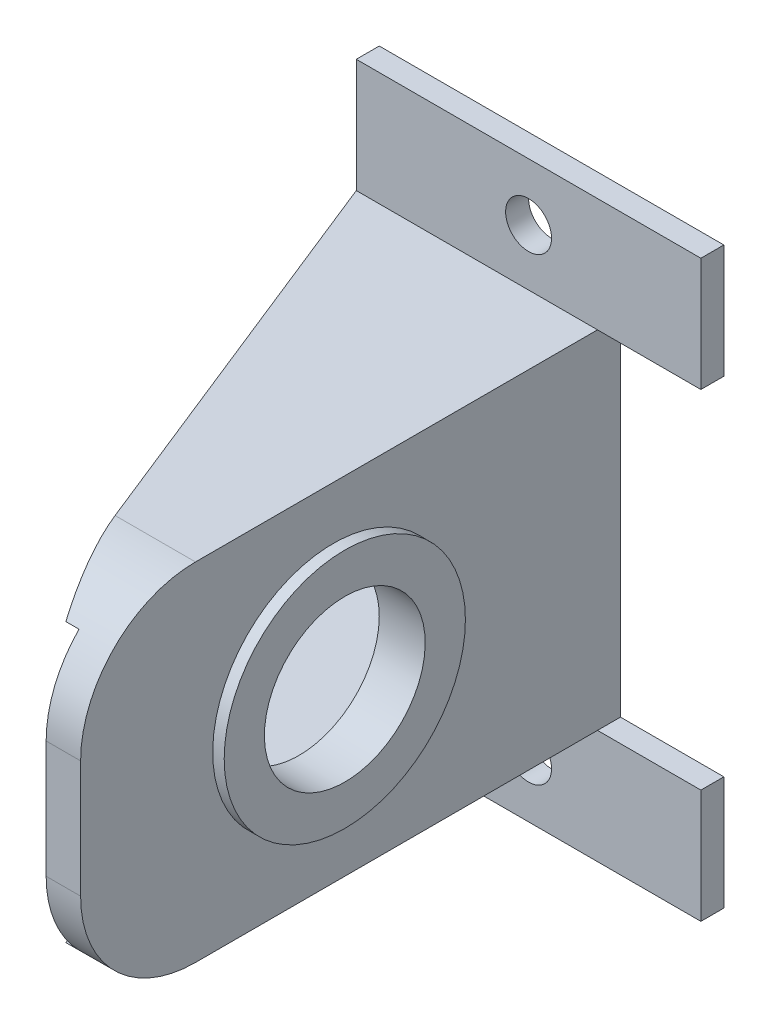
ISO-10303-21;
HEADER;
FILE_DESCRIPTION(('STEP AP214'),'2;1');
FILE_NAME('part.step','',(''),(''),'','','');
FILE_SCHEMA(('AUTOMOTIVE_DESIGN { 1 0 10303 214 1 1 1 1 }'));
ENDSEC;
DATA;
#1=APPLICATION_CONTEXT('core data for automotive mechanical design processes');
#2=APPLICATION_PROTOCOL_DEFINITION('international standard','automotive_design',2000,#1);
#3=PRODUCT_CONTEXT('',#1,'mechanical');
#4=PRODUCT('Part','Part','',(#3));
#5=PRODUCT_RELATED_PRODUCT_CATEGORY('part','',(#4));
#6=PRODUCT_DEFINITION_FORMATION('','',#4);
#7=PRODUCT_DEFINITION_CONTEXT('part definition',#1,'design');
#8=PRODUCT_DEFINITION('design','',#6,#7);
#9=PRODUCT_DEFINITION_SHAPE('','',#8);
#10=(LENGTH_UNIT() NAMED_UNIT(*) SI_UNIT(.MILLI.,.METRE.));
#11=(NAMED_UNIT(*) PLANE_ANGLE_UNIT() SI_UNIT($,.RADIAN.));
#12=(NAMED_UNIT(*) SI_UNIT($,.STERADIAN.) SOLID_ANGLE_UNIT());
#13=UNCERTAINTY_MEASURE_WITH_UNIT(LENGTH_MEASURE(1.E-05),#10,'distance_accuracy_value','');
#14=(GEOMETRIC_REPRESENTATION_CONTEXT(3) GLOBAL_UNCERTAINTY_ASSIGNED_CONTEXT((#13)) GLOBAL_UNIT_ASSIGNED_CONTEXT((#10,
#11,#12)) REPRESENTATION_CONTEXT('',''));
#15=CARTESIAN_POINT('',(0.,0.,0.));
#16=DIRECTION('',(0.,0.,1.));
#17=DIRECTION('',(1.,0.,0.));
#18=AXIS2_PLACEMENT_3D('',#15,#16,#17);
#19=CARTESIAN_POINT('',(0.,0.,2.));
#20=DIRECTION('',(0.,0.,-1.));
#21=DIRECTION('',(-1.,0.,0.));
#22=AXIS2_PLACEMENT_3D('',#19,#20,#21);
#23=PLANE('',#22);
#24=CARTESIAN_POINT('',(15.,5.,2.));
#25=DIRECTION('',(0.,0.,1.));
#26=DIRECTION('',(1.,0.,0.));
#27=AXIS2_PLACEMENT_3D('',#24,#25,#26);
#28=CIRCLE('',#27,2.);
#29=CARTESIAN_POINT('',(17.,5.,2.));
#30=VERTEX_POINT('',#29);
#31=EDGE_CURVE('E305',#30,#30,#28,.T.);
#32=ORIENTED_EDGE('',*,*,#31,.F.);
#33=EDGE_LOOP('',(#32));
#34=FACE_BOUND('',#33,.T.);
#35=DIRECTION('',(1.,0.,0.));
#36=VECTOR('',#35,1.);
#37=CARTESIAN_POINT('',(21.,9.90000000000001,2.));
#38=LINE('',#37,#36);
#39=CARTESIAN_POINT('',(0.,9.90000000000001,2.));
#40=VERTEX_POINT('',#39);
#41=CARTESIAN_POINT('',(21.,9.90000000000001,2.));
#42=VERTEX_POINT('',#41);
#43=EDGE_CURVE('E162',#40,#42,#38,.T.);
#44=ORIENTED_EDGE('',*,*,#43,.F.);
#45=DIRECTION('',(0.,-1.,0.));
#46=VECTOR('',#45,1.);
#47=CARTESIAN_POINT('',(0.,0.,2.));
#48=LINE('',#47,#46);
#49=CARTESIAN_POINT('',(0.,0.,2.));
#50=VERTEX_POINT('',#49);
#51=EDGE_CURVE('E167',#40,#50,#48,.T.);
#52=ORIENTED_EDGE('',*,*,#51,.T.);
#53=DIRECTION('',(1.,0.,0.));
#54=VECTOR('',#53,1.);
#55=CARTESIAN_POINT('',(0.,0.,2.));
#56=LINE('',#55,#54);
#57=CARTESIAN_POINT('',(30.,0.,2.));
#58=VERTEX_POINT('',#57);
#59=EDGE_CURVE('E189',#50,#58,#56,.T.);
#60=ORIENTED_EDGE('',*,*,#59,.T.);
#61=DIRECTION('',(0.,1.,0.));
#62=VECTOR('',#61,1.);
#63=CARTESIAN_POINT('',(30.,9.90000000000001,2.));
#64=LINE('',#63,#62);
#65=CARTESIAN_POINT('',(30.,9.90000000000001,2.));
#66=VERTEX_POINT('',#65);
#67=EDGE_CURVE('E194',#58,#66,#64,.T.);
#68=ORIENTED_EDGE('',*,*,#67,.T.);
#69=DIRECTION('',(-1.,0.,0.));
#70=VECTOR('',#69,1.);
#71=CARTESIAN_POINT('',(21.,9.90000000000001,2.));
#72=LINE('',#71,#70);
#73=EDGE_CURVE('E170',#66,#42,#72,.T.);
#74=ORIENTED_EDGE('',*,*,#73,.T.);
#75=EDGE_LOOP('',(#44,#52,#60,#68,#74));
#76=FACE_BOUND('',#75,.T.);
#77=ADVANCED_FACE('F32',(#34,#76),#23,.F.);
#78=DIRECTION('',(-1.,0.,0.));
#79=VECTOR('',#78,1.);
#80=CARTESIAN_POINT('',(18.,12.9,2.));
#81=LINE('',#80,#79);
#82=CARTESIAN_POINT('',(18.,12.9,2.));
#83=VERTEX_POINT('',#82);
#84=CARTESIAN_POINT('',(0.,12.9,2.));
#85=VERTEX_POINT('',#84);
#86=EDGE_CURVE('E173',#83,#85,#81,.T.);
#87=ORIENTED_EDGE('',*,*,#86,.F.);
#88=DIRECTION('',(0.,-1.,0.));
#89=VECTOR('',#88,1.);
#90=CARTESIAN_POINT('',(18.,37.1,2.));
#91=LINE('',#90,#89);
#92=CARTESIAN_POINT('',(18.,37.1,2.));
#93=VERTEX_POINT('',#92);
#94=EDGE_CURVE('E381',#93,#83,#91,.T.);
#95=ORIENTED_EDGE('',*,*,#94,.F.);
#96=DIRECTION('',(1.,0.,0.));
#97=VECTOR('',#96,1.);
#98=CARTESIAN_POINT('',(0.,37.1,2.));
#99=LINE('',#98,#97);
#100=CARTESIAN_POINT('',(0.,37.1,2.));
#101=VERTEX_POINT('',#100);
#102=EDGE_CURVE('E296',#101,#93,#99,.T.);
#103=ORIENTED_EDGE('',*,*,#102,.F.);
#104=EDGE_CURVE('E180',#101,#85,#48,.T.);
#105=ORIENTED_EDGE('',*,*,#104,.T.);
#106=EDGE_LOOP('',(#87,#95,#103,#105));
#107=FACE_BOUND('',#106,.T.);
#108=ADVANCED_FACE('F336',(#107),#23,.F.);
#109=CARTESIAN_POINT('',(15.,45.,2.));
#110=DIRECTION('',(0.,0.,1.));
#111=DIRECTION('',(1.,0.,0.));
#112=AXIS2_PLACEMENT_3D('',#109,#110,#111);
#113=CIRCLE('',#112,2.);
#114=CARTESIAN_POINT('',(17.,45.,2.));
#115=VERTEX_POINT('',#114);
#116=EDGE_CURVE('E209',#115,#115,#113,.T.);
#117=ORIENTED_EDGE('',*,*,#116,.F.);
#118=EDGE_LOOP('',(#117));
#119=FACE_BOUND('',#118,.T.);
#120=DIRECTION('',(-1.,0.,0.));
#121=VECTOR('',#120,1.);
#122=CARTESIAN_POINT('',(18.,40.1,2.));
#123=LINE('',#122,#121);
#124=CARTESIAN_POINT('',(21.,40.1,2.));
#125=VERTEX_POINT('',#124);
#126=CARTESIAN_POINT('',(0.,40.1,2.));
#127=VERTEX_POINT('',#126);
#128=EDGE_CURVE('E351',#125,#127,#123,.T.);
#129=ORIENTED_EDGE('',*,*,#128,.F.);
#130=DIRECTION('',(1.,0.,0.));
#131=VECTOR('',#130,1.);
#132=CARTESIAN_POINT('',(30.,40.1,2.));
#133=LINE('',#132,#131);
#134=CARTESIAN_POINT('',(30.,40.1,2.));
#135=VERTEX_POINT('',#134);
#136=EDGE_CURVE('E199',#125,#135,#133,.T.);
#137=ORIENTED_EDGE('',*,*,#136,.T.);
#138=DIRECTION('',(0.,1.,0.));
#139=VECTOR('',#138,1.);
#140=CARTESIAN_POINT('',(30.,50.,2.));
#141=LINE('',#140,#139);
#142=CARTESIAN_POINT('',(30.,50.,2.));
#143=VERTEX_POINT('',#142);
#144=EDGE_CURVE('E201',#135,#143,#141,.T.);
#145=ORIENTED_EDGE('',*,*,#144,.T.);
#146=DIRECTION('',(-1.,0.,0.));
#147=VECTOR('',#146,1.);
#148=CARTESIAN_POINT('',(0.,50.,2.));
#149=LINE('',#148,#147);
#150=CARTESIAN_POINT('',(0.,50.,2.));
#151=VERTEX_POINT('',#150);
#152=EDGE_CURVE('E203',#143,#151,#149,.T.);
#153=ORIENTED_EDGE('',*,*,#152,.T.);
#154=EDGE_CURVE('E183',#151,#127,#48,.T.);
#155=ORIENTED_EDGE('',*,*,#154,.T.);
#156=EDGE_LOOP('',(#129,#137,#145,#153,#155));
#157=FACE_BOUND('',#156,.T.);
#158=ADVANCED_FACE('F338',(#119,#157),#23,.F.);
#159=CARTESIAN_POINT('',(0.,0.,0.));
#160=DIRECTION('',(0.,0.,-1.));
#161=DIRECTION('',(-1.,0.,0.));
#162=AXIS2_PLACEMENT_3D('',#159,#160,#161);
#163=PLANE('',#162);
#164=CARTESIAN_POINT('',(15.,45.,0.));
#165=DIRECTION('',(0.,0.,1.));
#166=DIRECTION('',(1.,0.,0.));
#167=AXIS2_PLACEMENT_3D('',#164,#165,#166);
#168=CIRCLE('',#167,2.);
#169=CARTESIAN_POINT('',(17.,45.,0.));
#170=VERTEX_POINT('',#169);
#171=EDGE_CURVE('E308',#170,#170,#168,.T.);
#172=ORIENTED_EDGE('',*,*,#171,.T.);
#173=EDGE_LOOP('',(#172));
#174=FACE_BOUND('',#173,.T.);
#175=DIRECTION('',(0.,-1.,0.));
#176=VECTOR('',#175,1.);
#177=CARTESIAN_POINT('',(0.,0.,0.));
#178=LINE('',#177,#176);
#179=CARTESIAN_POINT('',(0.,50.,0.));
#180=VERTEX_POINT('',#179);
#181=CARTESIAN_POINT('',(0.,0.,0.));
#182=VERTEX_POINT('',#181);
#183=EDGE_CURVE('E206',#180,#182,#178,.T.);
#184=ORIENTED_EDGE('',*,*,#183,.F.);
#185=DIRECTION('',(-1.,0.,0.));
#186=VECTOR('',#185,1.);
#187=CARTESIAN_POINT('',(0.,50.,0.));
#188=LINE('',#187,#186);
#189=CARTESIAN_POINT('',(30.,50.,0.));
#190=VERTEX_POINT('',#189);
#191=EDGE_CURVE('E181',#190,#180,#188,.T.);
#192=ORIENTED_EDGE('',*,*,#191,.F.);
#193=DIRECTION('',(0.,1.,0.));
#194=VECTOR('',#193,1.);
#195=CARTESIAN_POINT('',(30.,50.,0.));
#196=LINE('',#195,#194);
#197=CARTESIAN_POINT('',(30.,40.1,0.));
#198=VERTEX_POINT('',#197);
#199=EDGE_CURVE('E184',#198,#190,#196,.T.);
#200=ORIENTED_EDGE('',*,*,#199,.F.);
#201=DIRECTION('',(1.,0.,0.));
#202=VECTOR('',#201,1.);
#203=CARTESIAN_POINT('',(30.,40.1,0.));
#204=LINE('',#203,#202);
#205=CARTESIAN_POINT('',(21.,40.1,0.));
#206=VERTEX_POINT('',#205);
#207=EDGE_CURVE('E217',#206,#198,#204,.T.);
#208=ORIENTED_EDGE('',*,*,#207,.F.);
#209=DIRECTION('',(0.,1.,0.));
#210=VECTOR('',#209,1.);
#211=CARTESIAN_POINT('',(21.,40.1,0.));
#212=LINE('',#211,#210);
#213=CARTESIAN_POINT('',(21.,9.90000000000001,0.));
#214=VERTEX_POINT('',#213);
#215=EDGE_CURVE('E215',#214,#206,#212,.T.);
#216=ORIENTED_EDGE('',*,*,#215,.F.);
#217=DIRECTION('',(-1.,0.,0.));
#218=VECTOR('',#217,1.);
#219=CARTESIAN_POINT('',(21.,9.90000000000001,0.));
#220=LINE('',#219,#218);
#221=CARTESIAN_POINT('',(30.,9.90000000000001,0.));
#222=VERTEX_POINT('',#221);
#223=EDGE_CURVE('E213',#222,#214,#220,.T.);
#224=ORIENTED_EDGE('',*,*,#223,.F.);
#225=DIRECTION('',(0.,1.,0.));
#226=VECTOR('',#225,1.);
#227=CARTESIAN_POINT('',(30.,9.90000000000001,0.));
#228=LINE('',#227,#226);
#229=CARTESIAN_POINT('',(30.,0.,0.));
#230=VERTEX_POINT('',#229);
#231=EDGE_CURVE('E211',#230,#222,#228,.T.);
#232=ORIENTED_EDGE('',*,*,#231,.F.);
#233=DIRECTION('',(1.,0.,0.));
#234=VECTOR('',#233,1.);
#235=CARTESIAN_POINT('',(0.,0.,0.));
#236=LINE('',#235,#234);
#237=EDGE_CURVE('E208',#182,#230,#236,.T.);
#238=ORIENTED_EDGE('',*,*,#237,.F.);
#239=EDGE_LOOP('',(#184,#192,#200,#208,#216,#224,#232,#238));
#240=FACE_BOUND('',#239,.T.);
#241=CARTESIAN_POINT('',(15.,5.,0.));
#242=DIRECTION('',(0.,0.,1.));
#243=DIRECTION('',(1.,0.,0.));
#244=AXIS2_PLACEMENT_3D('',#241,#242,#243);
#245=CIRCLE('',#244,2.);
#246=CARTESIAN_POINT('',(17.,5.,0.));
#247=VERTEX_POINT('',#246);
#248=EDGE_CURVE('E299',#247,#247,#245,.T.);
#249=ORIENTED_EDGE('',*,*,#248,.T.);
#250=EDGE_LOOP('',(#249));
#251=FACE_BOUND('',#250,.T.);
#252=ADVANCED_FACE('F315',(#174,#240,#251),#163,.T.);
#253=CARTESIAN_POINT('',(0.,0.,2.));
#254=DIRECTION('',(1.,0.,0.));
#255=DIRECTION('',(0.,0.,-1.));
#256=AXIS2_PLACEMENT_3D('',#253,#254,#255);
#257=PLANE('',#256);
#258=ORIENTED_EDGE('',*,*,#51,.F.);
#259=DIRECTION('',(0.,-1.,0.));
#260=VECTOR('',#259,1.);
#261=CARTESIAN_POINT('',(0.,88.5664832642105,2.));
#262=LINE('',#261,#260);
#263=EDGE_CURVE('E149',#85,#40,#262,.T.);
#264=ORIENTED_EDGE('',*,*,#263,.F.);
#265=ORIENTED_EDGE('',*,*,#104,.F.);
#266=EDGE_CURVE('E157',#127,#101,#262,.T.);
#267=ORIENTED_EDGE('',*,*,#266,.F.);
#268=ORIENTED_EDGE('',*,*,#154,.F.);
#269=DIRECTION('',(0.,0.,-1.));
#270=VECTOR('',#269,1.);
#271=CARTESIAN_POINT('',(0.,50.,2.));
#272=LINE('',#271,#270);
#273=EDGE_CURVE('E205',#151,#180,#272,.T.);
#274=ORIENTED_EDGE('',*,*,#273,.T.);
#275=ORIENTED_EDGE('',*,*,#183,.T.);
#276=DIRECTION('',(0.,0.,-1.));
#277=VECTOR('',#276,1.);
#278=CARTESIAN_POINT('',(0.,0.,2.));
#279=LINE('',#278,#277);
#280=EDGE_CURVE('E179',#50,#182,#279,.T.);
#281=ORIENTED_EDGE('',*,*,#280,.F.);
#282=EDGE_LOOP('',(#258,#264,#265,#267,#268,#274,#275,#281));
#283=FACE_BOUND('',#282,.T.);
#284=ADVANCED_FACE('F176',(#283),#257,.F.);
#285=CARTESIAN_POINT('',(0.,0.,2.));
#286=DIRECTION('',(0.,1.,0.));
#287=DIRECTION('',(0.,0.,1.));
#288=AXIS2_PLACEMENT_3D('',#285,#286,#287);
#289=PLANE('',#288);
#290=ORIENTED_EDGE('',*,*,#237,.T.);
#291=DIRECTION('',(0.,0.,-1.));
#292=VECTOR('',#291,1.);
#293=CARTESIAN_POINT('',(30.,0.,2.));
#294=LINE('',#293,#292);
#295=EDGE_CURVE('E237',#58,#230,#294,.T.);
#296=ORIENTED_EDGE('',*,*,#295,.F.);
#297=ORIENTED_EDGE('',*,*,#59,.F.);
#298=ORIENTED_EDGE('',*,*,#280,.T.);
#299=EDGE_LOOP('',(#290,#296,#297,#298));
#300=FACE_BOUND('',#299,.T.);
#301=ADVANCED_FACE('F475',(#300),#289,.F.);
#302=CARTESIAN_POINT('',(30.,9.90000000000001,2.));
#303=DIRECTION('',(-1.,0.,0.));
#304=DIRECTION('',(0.,0.,1.));
#305=AXIS2_PLACEMENT_3D('',#302,#303,#304);
#306=PLANE('',#305);
#307=ORIENTED_EDGE('',*,*,#231,.T.);
#308=DIRECTION('',(0.,0.,-1.));
#309=VECTOR('',#308,1.);
#310=CARTESIAN_POINT('',(30.,9.90000000000001,2.));
#311=LINE('',#310,#309);
#312=EDGE_CURVE('E234',#66,#222,#311,.T.);
#313=ORIENTED_EDGE('',*,*,#312,.F.);
#314=ORIENTED_EDGE('',*,*,#67,.F.);
#315=ORIENTED_EDGE('',*,*,#295,.T.);
#316=EDGE_LOOP('',(#307,#313,#314,#315));
#317=FACE_BOUND('',#316,.T.);
#318=ADVANCED_FACE('F516',(#317),#306,.F.);
#319=CARTESIAN_POINT('',(21.,9.90000000000001,2.));
#320=DIRECTION('',(0.,-1.,0.));
#321=DIRECTION('',(0.,0.,-1.));
#322=AXIS2_PLACEMENT_3D('',#319,#320,#321);
#323=PLANE('',#322);
#324=ORIENTED_EDGE('',*,*,#223,.T.);
#325=DIRECTION('',(0.,0.,-1.));
#326=VECTOR('',#325,1.);
#327=CARTESIAN_POINT('',(21.,9.90000000000001,2.));
#328=LINE('',#327,#326);
#329=EDGE_CURVE('E231',#42,#214,#328,.T.);
#330=ORIENTED_EDGE('',*,*,#329,.F.);
#331=ORIENTED_EDGE('',*,*,#73,.F.);
#332=ORIENTED_EDGE('',*,*,#312,.T.);
#333=EDGE_LOOP('',(#324,#330,#331,#332));
#334=FACE_BOUND('',#333,.T.);
#335=ADVANCED_FACE('F511',(#334),#323,.F.);
#336=CARTESIAN_POINT('',(21.,40.1,2.));
#337=DIRECTION('',(-1.,0.,0.));
#338=DIRECTION('',(0.,-1.,0.));
#339=AXIS2_PLACEMENT_3D('',#336,#337,#338);
#340=PLANE('',#339);
#341=CARTESIAN_POINT('',(21.,25.,25.));
#342=DIRECTION('',(-1.,0.,0.));
#343=DIRECTION('',(0.,-1.,0.));
#344=AXIS2_PLACEMENT_3D('',#341,#342,#343);
#345=CIRCLE('',#344,10.5);
#346=CARTESIAN_POINT('',(21.,14.5,25.));
#347=VERTEX_POINT('',#346);
#348=EDGE_CURVE('E241',#347,#347,#345,.F.);
#349=ORIENTED_EDGE('',*,*,#348,.F.);
#350=EDGE_LOOP('',(#349));
#351=FACE_BOUND('',#350,.T.);
#352=DIRECTION('',(0.,0.,-1.));
#353=VECTOR('',#352,1.);
#354=CARTESIAN_POINT('',(21.,40.1,47.));
#355=LINE('',#354,#353);
#356=CARTESIAN_POINT('',(21.,40.1,37.));
#357=VERTEX_POINT('',#356);
#358=EDGE_CURVE('E271',#357,#125,#355,.T.);
#359=ORIENTED_EDGE('',*,*,#358,.F.);
#360=CARTESIAN_POINT('',(21.,30.1,37.));
#361=DIRECTION('',(-1.,0.,0.));
#362=DIRECTION('',(0.,-1.,0.));
#363=AXIS2_PLACEMENT_3D('',#360,#361,#362);
#364=CIRCLE('',#363,10.);
#365=CARTESIAN_POINT('',(21.,30.1,47.));
#366=VERTEX_POINT('',#365);
#367=EDGE_CURVE('E262',#357,#366,#364,.F.);
#368=ORIENTED_EDGE('',*,*,#367,.T.);
#369=DIRECTION('',(0.,1.,0.));
#370=VECTOR('',#369,1.);
#371=CARTESIAN_POINT('',(21.,40.1,47.));
#372=LINE('',#371,#370);
#373=CARTESIAN_POINT('',(21.,19.9,47.));
#374=VERTEX_POINT('',#373);
#375=EDGE_CURVE('E172',#374,#366,#372,.T.);
#376=ORIENTED_EDGE('',*,*,#375,.F.);
#377=CARTESIAN_POINT('',(21.,19.9,37.));
#378=DIRECTION('',(-1.,0.,0.));
#379=DIRECTION('',(0.,-1.,0.));
#380=AXIS2_PLACEMENT_3D('',#377,#378,#379);
#381=CIRCLE('',#380,10.);
#382=CARTESIAN_POINT('',(21.,9.90000000000001,37.));
#383=VERTEX_POINT('',#382);
#384=EDGE_CURVE('E260',#374,#383,#381,.F.);
#385=ORIENTED_EDGE('',*,*,#384,.T.);
#386=DIRECTION('',(0.,0.,-1.));
#387=VECTOR('',#386,1.);
#388=CARTESIAN_POINT('',(21.,9.90000000000001,47.));
#389=LINE('',#388,#387);
#390=EDGE_CURVE('E301',#383,#42,#389,.T.);
#391=ORIENTED_EDGE('',*,*,#390,.T.);
#392=ORIENTED_EDGE('',*,*,#329,.T.);
#393=ORIENTED_EDGE('',*,*,#215,.T.);
#394=DIRECTION('',(0.,0.,-1.));
#395=VECTOR('',#394,1.);
#396=CARTESIAN_POINT('',(21.,40.1,2.));
#397=LINE('',#396,#395);
#398=EDGE_CURVE('E228',#125,#206,#397,.T.);
#399=ORIENTED_EDGE('',*,*,#398,.F.);
#400=EDGE_LOOP('',(#359,#368,#376,#385,#391,#392,#393,#399));
#401=FACE_BOUND('',#400,.T.);
#402=ADVANCED_FACE('F269',(#351,#401),#340,.F.);
#403=CARTESIAN_POINT('',(30.,40.1,2.));
#404=DIRECTION('',(0.,1.,0.));
#405=DIRECTION('',(0.,0.,1.));
#406=AXIS2_PLACEMENT_3D('',#403,#404,#405);
#407=PLANE('',#406);
#408=ORIENTED_EDGE('',*,*,#207,.T.);
#409=DIRECTION('',(0.,0.,-1.));
#410=VECTOR('',#409,1.);
#411=CARTESIAN_POINT('',(30.,40.1,2.));
#412=LINE('',#411,#410);
#413=EDGE_CURVE('E225',#135,#198,#412,.T.);
#414=ORIENTED_EDGE('',*,*,#413,.F.);
#415=ORIENTED_EDGE('',*,*,#136,.F.);
#416=ORIENTED_EDGE('',*,*,#398,.T.);
#417=EDGE_LOOP('',(#408,#414,#415,#416));
#418=FACE_BOUND('',#417,.T.);
#419=ADVANCED_FACE('F361',(#418),#407,.F.);
#420=CARTESIAN_POINT('',(30.,50.,2.));
#421=DIRECTION('',(-1.,0.,0.));
#422=DIRECTION('',(0.,0.,1.));
#423=AXIS2_PLACEMENT_3D('',#420,#421,#422);
#424=PLANE('',#423);
#425=ORIENTED_EDGE('',*,*,#199,.T.);
#426=DIRECTION('',(0.,0.,-1.));
#427=VECTOR('',#426,1.);
#428=CARTESIAN_POINT('',(30.,50.,2.));
#429=LINE('',#428,#427);
#430=EDGE_CURVE('E222',#143,#190,#429,.T.);
#431=ORIENTED_EDGE('',*,*,#430,.F.);
#432=ORIENTED_EDGE('',*,*,#144,.F.);
#433=ORIENTED_EDGE('',*,*,#413,.T.);
#434=EDGE_LOOP('',(#425,#431,#432,#433));
#435=FACE_BOUND('',#434,.T.);
#436=ADVANCED_FACE('F331',(#435),#424,.F.);
#437=CARTESIAN_POINT('',(0.,50.,2.));
#438=DIRECTION('',(0.,-1.,0.));
#439=DIRECTION('',(0.,0.,-1.));
#440=AXIS2_PLACEMENT_3D('',#437,#438,#439);
#441=PLANE('',#440);
#442=ORIENTED_EDGE('',*,*,#191,.T.);
#443=ORIENTED_EDGE('',*,*,#273,.F.);
#444=ORIENTED_EDGE('',*,*,#152,.F.);
#445=ORIENTED_EDGE('',*,*,#430,.T.);
#446=EDGE_LOOP('',(#442,#443,#444,#445));
#447=FACE_BOUND('',#446,.T.);
#448=ADVANCED_FACE('F321',(#447),#441,.F.);
#449=CARTESIAN_POINT('',(15.,45.,2.));
#450=DIRECTION('',(0.,0.,-1.));
#451=DIRECTION('',(-1.,0.,0.));
#452=AXIS2_PLACEMENT_3D('',#449,#450,#451);
#453=CYLINDRICAL_SURFACE('',#452,2.);
#454=ORIENTED_EDGE('',*,*,#116,.T.);
#455=EDGE_LOOP('',(#454));
#456=FACE_BOUND('',#455,.T.);
#457=ORIENTED_EDGE('',*,*,#171,.F.);
#458=EDGE_LOOP('',(#457));
#459=FACE_BOUND('',#458,.T.);
#460=ADVANCED_FACE('F318',(#456,#459),#453,.F.);
#461=CARTESIAN_POINT('',(15.,5.,2.));
#462=DIRECTION('',(0.,0.,-1.));
#463=DIRECTION('',(-1.,0.,0.));
#464=AXIS2_PLACEMENT_3D('',#461,#462,#463);
#465=CYLINDRICAL_SURFACE('',#464,2.);
#466=ORIENTED_EDGE('',*,*,#31,.T.);
#467=EDGE_LOOP('',(#466));
#468=FACE_BOUND('',#467,.T.);
#469=ORIENTED_EDGE('',*,*,#248,.F.);
#470=EDGE_LOOP('',(#469));
#471=FACE_BOUND('',#470,.T.);
#472=ADVANCED_FACE('F320',(#468,#471),#465,.F.);
#473=CARTESIAN_POINT('',(18.,40.1,47.));
#474=DIRECTION('',(0.,-1.,0.));
#475=DIRECTION('',(0.,0.,-1.));
#476=AXIS2_PLACEMENT_3D('',#473,#474,#475);
#477=PLANE('',#476);
#478=DIRECTION('',(-0.371390676354104,0.,-0.928476690885259));
#479=VECTOR('',#478,1.);
#480=CARTESIAN_POINT('',(0.,40.1,2.));
#481=LINE('',#480,#479);
#482=CARTESIAN_POINT('',(14.,40.1,37.));
#483=VERTEX_POINT('',#482);
#484=EDGE_CURVE('E373',#483,#127,#481,.T.);
#485=ORIENTED_EDGE('',*,*,#484,.F.);
#486=DIRECTION('',(-1.,0.,0.));
#487=VECTOR('',#486,1.);
#488=CARTESIAN_POINT('',(18.,40.1,37.));
#489=LINE('',#488,#487);
#490=EDGE_CURVE('E258',#483,#357,#489,.F.);
#491=ORIENTED_EDGE('',*,*,#490,.T.);
#492=ORIENTED_EDGE('',*,*,#358,.T.);
#493=ORIENTED_EDGE('',*,*,#128,.T.);
#494=EDGE_LOOP('',(#485,#491,#492,#493));
#495=FACE_BOUND('',#494,.T.);
#496=ADVANCED_FACE('F328',(#495),#477,.F.);
#497=CARTESIAN_POINT('',(0.,37.1,47.));
#498=DIRECTION('',(0.,1.,0.));
#499=DIRECTION('',(0.,0.,1.));
#500=AXIS2_PLACEMENT_3D('',#497,#498,#499);
#501=PLANE('',#500);
#502=DIRECTION('',(0.,0.,-1.));
#503=VECTOR('',#502,1.);
#504=CARTESIAN_POINT('',(18.,37.1,47.));
#505=LINE('',#504,#503);
#506=CARTESIAN_POINT('',(18.,37.1,44.1414284285429));
#507=VERTEX_POINT('',#506);
#508=EDGE_CURVE('E289',#507,#93,#505,.T.);
#509=ORIENTED_EDGE('',*,*,#508,.F.);
#510=DIRECTION('',(-1.,0.,0.));
#511=VECTOR('',#510,1.);
#512=CARTESIAN_POINT('',(18.,37.1,44.1414284285429));
#513=LINE('',#512,#511);
#514=CARTESIAN_POINT('',(16.8565713714171,37.1,44.1414284285429));
#515=VERTEX_POINT('',#514);
#516=EDGE_CURVE('E254',#507,#515,#513,.T.);
#517=ORIENTED_EDGE('',*,*,#516,.T.);
#518=DIRECTION('',(-0.371390676354104,0.,-0.928476690885259));
#519=VECTOR('',#518,1.);
#520=CARTESIAN_POINT('',(15.5172413793103,37.1,40.7931034482759));
#521=LINE('',#520,#519);
#522=EDGE_CURVE('E356',#515,#101,#521,.T.);
#523=ORIENTED_EDGE('',*,*,#522,.T.);
#524=ORIENTED_EDGE('',*,*,#102,.T.);
#525=EDGE_LOOP('',(#509,#517,#523,#524));
#526=FACE_BOUND('',#525,.T.);
#527=ADVANCED_FACE('F293',(#526),#501,.F.);
#528=CARTESIAN_POINT('',(18.,37.1,47.));
#529=DIRECTION('',(1.,0.,0.));
#530=DIRECTION('',(0.,0.,-1.));
#531=AXIS2_PLACEMENT_3D('',#528,#529,#530);
#532=PLANE('',#531);
#533=CARTESIAN_POINT('',(18.,25.,25.));
#534=DIRECTION('',(1.,0.,0.));
#535=DIRECTION('',(0.,0.,-1.));
#536=AXIS2_PLACEMENT_3D('',#533,#534,#535);
#537=CIRCLE('',#536,7.);
#538=CARTESIAN_POINT('',(18.,25.,18.));
#539=VERTEX_POINT('',#538);
#540=EDGE_CURVE('E629',#539,#539,#537,.F.);
#541=ORIENTED_EDGE('',*,*,#540,.F.);
#542=EDGE_LOOP('',(#541));
#543=FACE_BOUND('',#542,.T.);
#544=DIRECTION('',(0.,-1.,0.));
#545=VECTOR('',#544,1.);
#546=CARTESIAN_POINT('',(18.,37.1,47.));
#547=LINE('',#546,#545);
#548=CARTESIAN_POINT('',(18.,30.1,47.));
#549=VERTEX_POINT('',#548);
#550=CARTESIAN_POINT('',(18.,19.9,47.));
#551=VERTEX_POINT('',#550);
#552=EDGE_CURVE('E280',#549,#551,#547,.T.);
#553=ORIENTED_EDGE('',*,*,#552,.F.);
#554=CARTESIAN_POINT('',(18.,30.1,37.));
#555=DIRECTION('',(1.,0.,0.));
#556=DIRECTION('',(0.,0.,-1.));
#557=AXIS2_PLACEMENT_3D('',#554,#555,#556);
#558=CIRCLE('',#557,10.);
#559=EDGE_CURVE('E252',#549,#507,#558,.F.);
#560=ORIENTED_EDGE('',*,*,#559,.T.);
#561=ORIENTED_EDGE('',*,*,#508,.T.);
#562=ORIENTED_EDGE('',*,*,#94,.T.);
#563=DIRECTION('',(0.,0.,-1.));
#564=VECTOR('',#563,1.);
#565=CARTESIAN_POINT('',(18.,12.9,47.));
#566=LINE('',#565,#564);
#567=CARTESIAN_POINT('',(18.,12.9,44.1414284285429));
#568=VERTEX_POINT('',#567);
#569=EDGE_CURVE('E297',#568,#83,#566,.T.);
#570=ORIENTED_EDGE('',*,*,#569,.F.);
#571=CARTESIAN_POINT('',(18.,19.9,37.));
#572=DIRECTION('',(1.,0.,0.));
#573=DIRECTION('',(0.,0.,-1.));
#574=AXIS2_PLACEMENT_3D('',#571,#572,#573);
#575=CIRCLE('',#574,10.);
#576=EDGE_CURVE('E250',#568,#551,#575,.F.);
#577=ORIENTED_EDGE('',*,*,#576,.T.);
#578=EDGE_LOOP('',(#553,#560,#561,#562,#570,#577));
#579=FACE_BOUND('',#578,.T.);
#580=ADVANCED_FACE('F287',(#543,#579),#532,.F.);
#581=CARTESIAN_POINT('',(18.,12.9,47.));
#582=DIRECTION('',(0.,-1.,0.));
#583=DIRECTION('',(1.,0.,0.));
#584=AXIS2_PLACEMENT_3D('',#581,#582,#583);
#585=PLANE('',#584);
#586=DIRECTION('',(0.371390676354104,0.,0.928476690885259));
#587=VECTOR('',#586,1.);
#588=CARTESIAN_POINT('',(18.,12.9,47.));
#589=LINE('',#588,#587);
#590=CARTESIAN_POINT('',(16.8565713714171,12.9,44.1414284285429));
#591=VERTEX_POINT('',#590);
#592=EDGE_CURVE('E152',#85,#591,#589,.T.);
#593=ORIENTED_EDGE('',*,*,#592,.T.);
#594=DIRECTION('',(1.,0.,0.));
#595=VECTOR('',#594,1.);
#596=CARTESIAN_POINT('',(16.8565713714171,12.9,44.1414284285429));
#597=LINE('',#596,#595);
#598=EDGE_CURVE('E11',#591,#568,#597,.T.);
#599=ORIENTED_EDGE('',*,*,#598,.T.);
#600=ORIENTED_EDGE('',*,*,#569,.T.);
#601=ORIENTED_EDGE('',*,*,#86,.T.);
#602=EDGE_LOOP('',(#593,#599,#600,#601));
#603=FACE_BOUND('',#602,.T.);
#604=ADVANCED_FACE('F389',(#603),#585,.F.);
#605=CARTESIAN_POINT('',(21.,9.90000000000001,47.));
#606=DIRECTION('',(0.,1.,0.));
#607=DIRECTION('',(0.,0.,1.));
#608=AXIS2_PLACEMENT_3D('',#605,#606,#607);
#609=PLANE('',#608);
#610=ORIENTED_EDGE('',*,*,#390,.F.);
#611=DIRECTION('',(1.,0.,0.));
#612=VECTOR('',#611,1.);
#613=CARTESIAN_POINT('',(21.,9.90000000000001,37.));
#614=LINE('',#613,#612);
#615=CARTESIAN_POINT('',(14.,9.90000000000001,37.));
#616=VERTEX_POINT('',#615);
#617=EDGE_CURVE('E54',#383,#616,#614,.F.);
#618=ORIENTED_EDGE('',*,*,#617,.T.);
#619=DIRECTION('',(0.371390676354104,0.,0.928476690885259));
#620=VECTOR('',#619,1.);
#621=CARTESIAN_POINT('',(0.,9.90000000000001,2.));
#622=LINE('',#621,#620);
#623=EDGE_CURVE('E151',#40,#616,#622,.T.);
#624=ORIENTED_EDGE('',*,*,#623,.F.);
#625=ORIENTED_EDGE('',*,*,#43,.T.);
#626=EDGE_LOOP('',(#610,#618,#624,#625));
#627=FACE_BOUND('',#626,.T.);
#628=ADVANCED_FACE('F161',(#627),#609,.F.);
#629=CARTESIAN_POINT('',(0.,0.,47.));
#630=DIRECTION('',(0.,0.,-1.));
#631=DIRECTION('',(-1.,0.,0.));
#632=AXIS2_PLACEMENT_3D('',#629,#630,#631);
#633=PLANE('',#632);
#634=ORIENTED_EDGE('',*,*,#375,.T.);
#635=DIRECTION('',(-1.,0.,0.));
#636=VECTOR('',#635,1.);
#637=CARTESIAN_POINT('',(0.,30.1,47.));
#638=LINE('',#637,#636);
#639=EDGE_CURVE('E247',#366,#549,#638,.T.);
#640=ORIENTED_EDGE('',*,*,#639,.T.);
#641=ORIENTED_EDGE('',*,*,#552,.T.);
#642=DIRECTION('',(1.,0.,0.));
#643=VECTOR('',#642,1.);
#644=CARTESIAN_POINT('',(0.,19.9,47.));
#645=LINE('',#644,#643);
#646=EDGE_CURVE('E244',#551,#374,#645,.T.);
#647=ORIENTED_EDGE('',*,*,#646,.T.);
#648=EDGE_LOOP('',(#634,#640,#641,#647));
#649=FACE_BOUND('',#648,.T.);
#650=ADVANCED_FACE('F276',(#649),#633,.F.);
#651=CARTESIAN_POINT('',(0.,88.5664832642105,2.));
#652=DIRECTION('',(0.928476690885259,0.,-0.371390676354104));
#653=DIRECTION('',(-0.371390676354104,0.,-0.92847669088526));
#654=AXIS2_PLACEMENT_3D('',#651,#652,#653);
#655=PLANE('',#654);
#656=ORIENTED_EDGE('',*,*,#623,.T.);
#657=CARTESIAN_POINT('',(14.,19.9,37.));
#658=DIRECTION('',(0.928476690885259,0.,-0.371390676354104));
#659=DIRECTION('',(0.371390676354104,0.,0.92847669088526));
#660=AXIS2_PLACEMENT_3D('',#657,#658,#659);
#661=ELLIPSE('',#660,10.770329614269,10.);
#662=EDGE_CURVE('E40',#616,#591,#661,.F.);
#663=ORIENTED_EDGE('',*,*,#662,.T.);
#664=ORIENTED_EDGE('',*,*,#592,.F.);
#665=ORIENTED_EDGE('',*,*,#263,.T.);
#666=EDGE_LOOP('',(#656,#663,#664,#665));
#667=FACE_BOUND('',#666,.T.);
#668=ADVANCED_FACE('F150',(#667),#655,.F.);
#669=ORIENTED_EDGE('',*,*,#522,.F.);
#670=CARTESIAN_POINT('',(14.,30.1,37.));
#671=DIRECTION('',(0.928476690885259,0.,-0.371390676354104));
#672=DIRECTION('',(-0.371390676354104,0.,-0.92847669088526));
#673=AXIS2_PLACEMENT_3D('',#670,#671,#672);
#674=ELLIPSE('',#673,10.770329614269,10.);
#675=EDGE_CURVE('E256',#515,#483,#674,.F.);
#676=ORIENTED_EDGE('',*,*,#675,.T.);
#677=ORIENTED_EDGE('',*,*,#484,.T.);
#678=ORIENTED_EDGE('',*,*,#266,.T.);
#679=EDGE_LOOP('',(#669,#676,#677,#678));
#680=FACE_BOUND('',#679,.T.);
#681=ADVANCED_FACE('F407',(#680),#655,.F.);
#682=CARTESIAN_POINT('',(22.,25.,25.));
#683=DIRECTION('',(-1.,0.,0.));
#684=DIRECTION('',(0.,-1.,0.));
#685=AXIS2_PLACEMENT_3D('',#682,#683,#684);
#686=CYLINDRICAL_SURFACE('',#685,10.5);
#687=CARTESIAN_POINT('',(22.,25.,25.));
#688=DIRECTION('',(1.,0.,0.));
#689=DIRECTION('',(0.,1.,0.));
#690=AXIS2_PLACEMENT_3D('',#687,#688,#689);
#691=CIRCLE('',#690,10.5);
#692=CARTESIAN_POINT('',(22.,35.5,25.));
#693=VERTEX_POINT('',#692);
#694=EDGE_CURVE('E163',#693,#693,#691,.T.);
#695=ORIENTED_EDGE('',*,*,#694,.F.);
#696=EDGE_LOOP('',(#695));
#697=FACE_BOUND('',#696,.T.);
#698=ORIENTED_EDGE('',*,*,#348,.T.);
#699=EDGE_LOOP('',(#698));
#700=FACE_BOUND('',#699,.T.);
#701=ADVANCED_FACE('F409',(#697,#700),#686,.T.);
#702=CARTESIAN_POINT('',(22.,25.,25.));
#703=DIRECTION('',(1.,0.,0.));
#704=DIRECTION('',(0.,1.,0.));
#705=AXIS2_PLACEMENT_3D('',#702,#703,#704);
#706=PLANE('',#705);
#707=CARTESIAN_POINT('',(22.,25.,25.));
#708=DIRECTION('',(1.,0.,0.));
#709=DIRECTION('',(0.,1.,0.));
#710=AXIS2_PLACEMENT_3D('',#707,#708,#709);
#711=CIRCLE('',#710,7.);
#712=CARTESIAN_POINT('',(22.,32.,25.));
#713=VERTEX_POINT('',#712);
#714=EDGE_CURVE('E626',#713,#713,#711,.T.);
#715=ORIENTED_EDGE('',*,*,#714,.F.);
#716=EDGE_LOOP('',(#715));
#717=FACE_BOUND('',#716,.T.);
#718=ORIENTED_EDGE('',*,*,#694,.T.);
#719=EDGE_LOOP('',(#718));
#720=FACE_BOUND('',#719,.T.);
#721=ADVANCED_FACE('F415',(#717,#720),#706,.T.);
#722=CARTESIAN_POINT('',(-0.00100000000000447,25.,25.));
#723=DIRECTION('',(1.,0.,0.));
#724=DIRECTION('',(0.,1.,0.));
#725=AXIS2_PLACEMENT_3D('',#722,#723,#724);
#726=CYLINDRICAL_SURFACE('',#725,7.);
#727=ORIENTED_EDGE('',*,*,#714,.T.);
#728=EDGE_LOOP('',(#727));
#729=FACE_BOUND('',#728,.T.);
#730=ORIENTED_EDGE('',*,*,#540,.T.);
#731=EDGE_LOOP('',(#730));
#732=FACE_BOUND('',#731,.T.);
#733=ADVANCED_FACE('F442',(#729,#732),#726,.F.);
#734=CARTESIAN_POINT('',(0.,30.1,37.));
#735=DIRECTION('',(-1.,0.,0.));
#736=DIRECTION('',(0.,0.,1.));
#737=AXIS2_PLACEMENT_3D('',#734,#735,#736);
#738=CYLINDRICAL_SURFACE('',#737,10.);
#739=ORIENTED_EDGE('',*,*,#367,.F.);
#740=ORIENTED_EDGE('',*,*,#490,.F.);
#741=ORIENTED_EDGE('',*,*,#675,.F.);
#742=ORIENTED_EDGE('',*,*,#516,.F.);
#743=ORIENTED_EDGE('',*,*,#559,.F.);
#744=ORIENTED_EDGE('',*,*,#639,.F.);
#745=EDGE_LOOP('',(#739,#740,#741,#742,#743,#744));
#746=FACE_BOUND('',#745,.T.);
#747=ADVANCED_FACE('F282',(#746),#738,.T.);
#748=CARTESIAN_POINT('',(0.,19.9,37.));
#749=DIRECTION('',(1.,0.,0.));
#750=DIRECTION('',(0.,0.,-1.));
#751=AXIS2_PLACEMENT_3D('',#748,#749,#750);
#752=CYLINDRICAL_SURFACE('',#751,10.);
#753=ORIENTED_EDGE('',*,*,#662,.F.);
#754=ORIENTED_EDGE('',*,*,#617,.F.);
#755=ORIENTED_EDGE('',*,*,#384,.F.);
#756=ORIENTED_EDGE('',*,*,#646,.F.);
#757=ORIENTED_EDGE('',*,*,#576,.F.);
#758=ORIENTED_EDGE('',*,*,#598,.F.);
#759=EDGE_LOOP('',(#753,#754,#755,#756,#757,#758));
#760=FACE_BOUND('',#759,.T.);
#761=ADVANCED_FACE('F34',(#760),#752,.T.);
#762=CLOSED_SHELL('',(#77,#108,#158,#252,#284,#301,#318,#335,#402,#419,#436,#448,#460,#472,#496,
#527,#580,#604,#628,#650,#668,#681,#701,#721,#733,#747,#761));
#763=MANIFOLD_SOLID_BREP('B2',#762);
#764=ADVANCED_BREP_SHAPE_REPRESENTATION('',(#18,#763),#14);
#765=SHAPE_DEFINITION_REPRESENTATION(#9,#764);
ENDSEC;
END-ISO-10303-21;
